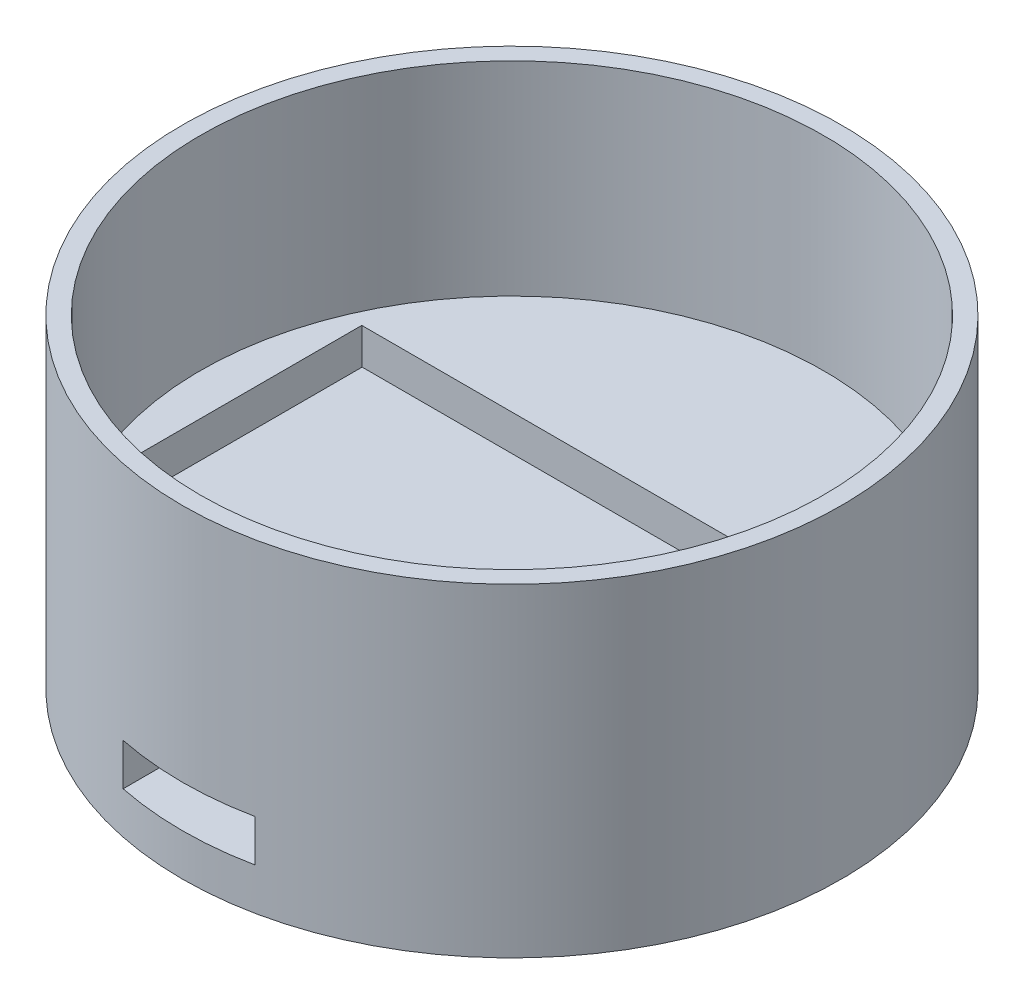
ISO-10303-21;
HEADER;
FILE_DESCRIPTION(('STEP AP214'),'2;1');
FILE_NAME('part.step','',(''),(''),'','','');
FILE_SCHEMA(('AUTOMOTIVE_DESIGN { 1 0 10303 214 1 1 1 1 }'));
ENDSEC;
DATA;
#1=APPLICATION_CONTEXT('core data for automotive mechanical design processes');
#2=APPLICATION_PROTOCOL_DEFINITION('international standard','automotive_design',2000,#1);
#3=PRODUCT_CONTEXT('',#1,'mechanical');
#4=PRODUCT('Part','Part','',(#3));
#5=PRODUCT_RELATED_PRODUCT_CATEGORY('part','',(#4));
#6=PRODUCT_DEFINITION_FORMATION('','',#4);
#7=PRODUCT_DEFINITION_CONTEXT('part definition',#1,'design');
#8=PRODUCT_DEFINITION('design','',#6,#7);
#9=PRODUCT_DEFINITION_SHAPE('','',#8);
#10=(LENGTH_UNIT() NAMED_UNIT(*) SI_UNIT(.MILLI.,.METRE.));
#11=(NAMED_UNIT(*) PLANE_ANGLE_UNIT() SI_UNIT($,.RADIAN.));
#12=(NAMED_UNIT(*) SI_UNIT($,.STERADIAN.) SOLID_ANGLE_UNIT());
#13=UNCERTAINTY_MEASURE_WITH_UNIT(LENGTH_MEASURE(1.E-05),#10,'distance_accuracy_value','');
#14=(GEOMETRIC_REPRESENTATION_CONTEXT(3) GLOBAL_UNCERTAINTY_ASSIGNED_CONTEXT((#13)) GLOBAL_UNIT_ASSIGNED_CONTEXT((#10,
#11,#12)) REPRESENTATION_CONTEXT('',''));
#15=CARTESIAN_POINT('',(0.,0.,0.));
#16=DIRECTION('',(0.,0.,1.));
#17=DIRECTION('',(1.,0.,0.));
#18=AXIS2_PLACEMENT_3D('',#15,#16,#17);
#19=CARTESIAN_POINT('',(0.,20.,0.));
#20=DIRECTION('',(0.,-1.,0.));
#21=DIRECTION('',(0.,0.,-1.));
#22=AXIS2_PLACEMENT_3D('',#19,#20,#21);
#23=CYLINDRICAL_SURFACE('',#22,26.);
#24=CARTESIAN_POINT('',(0.,3.,0.));
#25=DIRECTION('',(0.,1.,0.));
#26=DIRECTION('',(0.,0.,1.));
#27=AXIS2_PLACEMENT_3D('',#24,#25,#26);
#28=CIRCLE('',#27,26.);
#29=CARTESIAN_POINT('',(0.,3.,26.));
#30=VERTEX_POINT('',#29);
#31=EDGE_CURVE('E260',#30,#30,#28,.T.);
#32=ORIENTED_EDGE('',*,*,#31,.F.);
#33=EDGE_LOOP('',(#32));
#34=FACE_BOUND('',#33,.T.);
#35=CARTESIAN_POINT('',(0.,20.,0.));
#36=DIRECTION('',(0.,1.,0.));
#37=DIRECTION('',(0.,0.,1.));
#38=AXIS2_PLACEMENT_3D('',#35,#36,#37);
#39=CIRCLE('',#38,26.);
#40=CARTESIAN_POINT('',(0.,20.,26.));
#41=VERTEX_POINT('',#40);
#42=EDGE_CURVE('E252',#41,#41,#39,.T.);
#43=ORIENTED_EDGE('',*,*,#42,.T.);
#44=EDGE_LOOP('',(#43));
#45=FACE_BOUND('',#44,.T.);
#46=ADVANCED_FACE('F50',(#34,#45),#23,.F.);
#47=CARTESIAN_POINT('',(0.,20.,0.));
#48=DIRECTION('',(0.,-1.,0.));
#49=DIRECTION('',(0.,0.,-1.));
#50=AXIS2_PLACEMENT_3D('',#47,#48,#49);
#51=CYLINDRICAL_SURFACE('',#50,27.5);
#52=DIRECTION('',(0.,-1.,0.));
#53=VECTOR('',#52,1.);
#54=CARTESIAN_POINT('',(5.5,20.,26.944387170615));
#55=LINE('',#54,#53);
#56=CARTESIAN_POINT('',(5.5,0.,26.944387170615));
#57=VERTEX_POINT('',#56);
#58=CARTESIAN_POINT('',(5.5,-3.5,26.944387170615));
#59=VERTEX_POINT('',#58);
#60=EDGE_CURVE('E138',#57,#59,#55,.T.);
#61=ORIENTED_EDGE('',*,*,#60,.T.);
#62=CARTESIAN_POINT('',(0.,-3.5,0.));
#63=DIRECTION('',(0.,-1.,0.));
#64=DIRECTION('',(0.,0.,-1.));
#65=AXIS2_PLACEMENT_3D('',#62,#63,#64);
#66=CIRCLE('',#65,27.5);
#67=CARTESIAN_POINT('',(-5.5,-3.5,26.944387170615));
#68=VERTEX_POINT('',#67);
#69=EDGE_CURVE('E65',#59,#68,#66,.T.);
#70=ORIENTED_EDGE('',*,*,#69,.T.);
#71=DIRECTION('',(0.,-1.,0.));
#72=VECTOR('',#71,1.);
#73=CARTESIAN_POINT('',(-5.5,20.,26.944387170615));
#74=LINE('',#73,#72);
#75=CARTESIAN_POINT('',(-5.5,0.,26.944387170615));
#76=VERTEX_POINT('',#75);
#77=EDGE_CURVE('E148',#68,#76,#74,.F.);
#78=ORIENTED_EDGE('',*,*,#77,.T.);
#79=CARTESIAN_POINT('',(0.,0.,0.));
#80=DIRECTION('',(0.,1.,0.));
#81=DIRECTION('',(0.,0.,1.));
#82=AXIS2_PLACEMENT_3D('',#79,#80,#81);
#83=CIRCLE('',#82,27.5);
#84=EDGE_CURVE('E153',#76,#57,#83,.T.);
#85=ORIENTED_EDGE('',*,*,#84,.T.);
#86=EDGE_LOOP('',(#61,#70,#78,#85));
#87=FACE_BOUND('',#86,.T.);
#88=CARTESIAN_POINT('',(0.,20.,0.));
#89=DIRECTION('',(0.,1.,0.));
#90=DIRECTION('',(0.,0.,1.));
#91=AXIS2_PLACEMENT_3D('',#88,#89,#90);
#92=CIRCLE('',#91,27.5);
#93=CARTESIAN_POINT('',(0.,20.,27.5));
#94=VERTEX_POINT('',#93);
#95=EDGE_CURVE('E256',#94,#94,#92,.T.);
#96=ORIENTED_EDGE('',*,*,#95,.F.);
#97=EDGE_LOOP('',(#96));
#98=FACE_BOUND('',#97,.T.);
#99=CARTESIAN_POINT('',(0.,-7.,0.));
#100=DIRECTION('',(0.,1.,0.));
#101=DIRECTION('',(0.,0.,1.));
#102=AXIS2_PLACEMENT_3D('',#99,#100,#101);
#103=CIRCLE('',#102,27.5);
#104=CARTESIAN_POINT('',(0.,-7.,27.5));
#105=VERTEX_POINT('',#104);
#106=EDGE_CURVE('E182',#105,#105,#103,.T.);
#107=ORIENTED_EDGE('',*,*,#106,.T.);
#108=EDGE_LOOP('',(#107));
#109=FACE_BOUND('',#108,.T.);
#110=ADVANCED_FACE('F150',(#87,#98,#109),#51,.T.);
#111=CARTESIAN_POINT('',(0.,20.,0.));
#112=DIRECTION('',(0.,1.,0.));
#113=DIRECTION('',(0.,0.,1.));
#114=AXIS2_PLACEMENT_3D('',#111,#112,#113);
#115=PLANE('',#114);
#116=ORIENTED_EDGE('',*,*,#42,.F.);
#117=EDGE_LOOP('',(#116));
#118=FACE_BOUND('',#117,.T.);
#119=ORIENTED_EDGE('',*,*,#95,.T.);
#120=EDGE_LOOP('',(#119));
#121=FACE_BOUND('',#120,.T.);
#122=ADVANCED_FACE('F317',(#118,#121),#115,.T.);
#123=CARTESIAN_POINT('',(22.4697410318971,3.,0.));
#124=DIRECTION('',(-1.,0.,0.));
#125=DIRECTION('',(0.,0.,1.));
#126=AXIS2_PLACEMENT_3D('',#123,#124,#125);
#127=PLANE('',#126);
#128=DIRECTION('',(0.,0.,-1.));
#129=VECTOR('',#128,1.);
#130=CARTESIAN_POINT('',(22.4697410318971,0.,0.));
#131=LINE('',#130,#129);
#132=CARTESIAN_POINT('',(22.4697410318971,0.,10.));
#133=VERTEX_POINT('',#132);
#134=CARTESIAN_POINT('',(22.4697410318971,0.,-10.));
#135=VERTEX_POINT('',#134);
#136=EDGE_CURVE('E208',#133,#135,#131,.T.);
#137=ORIENTED_EDGE('',*,*,#136,.F.);
#138=DIRECTION('',(0.,-1.,0.));
#139=VECTOR('',#138,1.);
#140=CARTESIAN_POINT('',(22.4697410318971,3.,10.));
#141=LINE('',#140,#139);
#142=CARTESIAN_POINT('',(22.4697410318971,3.,10.));
#143=VERTEX_POINT('',#142);
#144=EDGE_CURVE('E248',#143,#133,#141,.T.);
#145=ORIENTED_EDGE('',*,*,#144,.F.);
#146=DIRECTION('',(0.,0.,-1.));
#147=VECTOR('',#146,1.);
#148=CARTESIAN_POINT('',(22.4697410318971,3.,0.));
#149=LINE('',#148,#147);
#150=CARTESIAN_POINT('',(22.4697410318971,3.,-10.));
#151=VERTEX_POINT('',#150);
#152=EDGE_CURVE('E212',#143,#151,#149,.T.);
#153=ORIENTED_EDGE('',*,*,#152,.T.);
#154=DIRECTION('',(0.,-1.,0.));
#155=VECTOR('',#154,1.);
#156=CARTESIAN_POINT('',(22.4697410318971,3.,-10.));
#157=LINE('',#156,#155);
#158=EDGE_CURVE('E227',#151,#135,#157,.T.);
#159=ORIENTED_EDGE('',*,*,#158,.T.);
#160=EDGE_LOOP('',(#137,#145,#153,#159));
#161=FACE_BOUND('',#160,.T.);
#162=ADVANCED_FACE('F301',(#161),#127,.T.);
#163=CARTESIAN_POINT('',(0.,3.,10.));
#164=DIRECTION('',(0.,0.,-1.));
#165=DIRECTION('',(-1.,0.,0.));
#166=AXIS2_PLACEMENT_3D('',#163,#164,#165);
#167=PLANE('',#166);
#168=DIRECTION('',(1.,0.,0.));
#169=VECTOR('',#168,1.);
#170=CARTESIAN_POINT('',(0.,0.,10.));
#171=LINE('',#170,#169);
#172=CARTESIAN_POINT('',(-22.5,0.,10.));
#173=VERTEX_POINT('',#172);
#174=CARTESIAN_POINT('',(-5.5,0.,10.));
#175=VERTEX_POINT('',#174);
#176=EDGE_CURVE('E232',#173,#175,#171,.T.);
#177=ORIENTED_EDGE('',*,*,#176,.F.);
#178=DIRECTION('',(0.,1.,0.));
#179=VECTOR('',#178,1.);
#180=CARTESIAN_POINT('',(-22.5,-7.,10.));
#181=LINE('',#180,#179);
#182=CARTESIAN_POINT('',(-22.5,-7.,10.));
#183=VERTEX_POINT('',#182);
#184=EDGE_CURVE('E200',#183,#173,#181,.T.);
#185=ORIENTED_EDGE('',*,*,#184,.F.);
#186=DIRECTION('',(1.,0.,0.));
#187=VECTOR('',#186,1.);
#188=CARTESIAN_POINT('',(0.,-7.,10.));
#189=LINE('',#188,#187);
#190=CARTESIAN_POINT('',(-22.5302589681029,-7.,10.));
#191=VERTEX_POINT('',#190);
#192=EDGE_CURVE('E189',#191,#183,#189,.T.);
#193=ORIENTED_EDGE('',*,*,#192,.F.);
#194=DIRECTION('',(0.,-1.,0.));
#195=VECTOR('',#194,1.);
#196=CARTESIAN_POINT('',(-22.5302589681029,3.,10.));
#197=LINE('',#196,#195);
#198=CARTESIAN_POINT('',(-22.5302589681029,3.,10.));
#199=VERTEX_POINT('',#198);
#200=EDGE_CURVE('E245',#199,#191,#197,.T.);
#201=ORIENTED_EDGE('',*,*,#200,.F.);
#202=DIRECTION('',(1.,0.,0.));
#203=VECTOR('',#202,1.);
#204=CARTESIAN_POINT('',(0.,3.,10.));
#205=LINE('',#204,#203);
#206=EDGE_CURVE('E216',#199,#143,#205,.T.);
#207=ORIENTED_EDGE('',*,*,#206,.T.);
#208=ORIENTED_EDGE('',*,*,#144,.T.);
#209=CARTESIAN_POINT('',(5.5,0.,10.));
#210=VERTEX_POINT('',#209);
#211=EDGE_CURVE('E231',#210,#133,#171,.T.);
#212=ORIENTED_EDGE('',*,*,#211,.F.);
#213=EDGE_CURVE('E236',#175,#210,#171,.T.);
#214=ORIENTED_EDGE('',*,*,#213,.F.);
#215=EDGE_LOOP('',(#177,#185,#193,#201,#207,#208,#212,#214));
#216=FACE_BOUND('',#215,.T.);
#217=ADVANCED_FACE('F274',(#216),#167,.T.);
#218=CARTESIAN_POINT('',(-22.5302589681029,3.,0.));
#219=DIRECTION('',(-1.,0.,0.));
#220=DIRECTION('',(0.,0.,1.));
#221=AXIS2_PLACEMENT_3D('',#218,#219,#220);
#222=PLANE('',#221);
#223=ORIENTED_EDGE('',*,*,#200,.T.);
#224=DIRECTION('',(0.,0.,-1.));
#225=VECTOR('',#224,1.);
#226=CARTESIAN_POINT('',(-22.5302589681029,-7.,0.));
#227=LINE('',#226,#225);
#228=CARTESIAN_POINT('',(-22.5302589681029,-7.,-10.));
#229=VERTEX_POINT('',#228);
#230=EDGE_CURVE('E192',#191,#229,#227,.T.);
#231=ORIENTED_EDGE('',*,*,#230,.T.);
#232=DIRECTION('',(0.,-1.,0.));
#233=VECTOR('',#232,1.);
#234=CARTESIAN_POINT('',(-22.5302589681029,3.,-10.));
#235=LINE('',#234,#233);
#236=CARTESIAN_POINT('',(-22.5302589681029,3.,-10.));
#237=VERTEX_POINT('',#236);
#238=EDGE_CURVE('E242',#237,#229,#235,.T.);
#239=ORIENTED_EDGE('',*,*,#238,.F.);
#240=DIRECTION('',(0.,0.,-1.));
#241=VECTOR('',#240,1.);
#242=CARTESIAN_POINT('',(-22.5302589681029,3.,0.));
#243=LINE('',#242,#241);
#244=EDGE_CURVE('E221',#199,#237,#243,.T.);
#245=ORIENTED_EDGE('',*,*,#244,.F.);
#246=EDGE_LOOP('',(#223,#231,#239,#245));
#247=FACE_BOUND('',#246,.T.);
#248=ADVANCED_FACE('F292',(#247),#222,.F.);
#249=CARTESIAN_POINT('',(0.,3.,-10.));
#250=DIRECTION('',(0.,0.,-1.));
#251=DIRECTION('',(-1.,0.,0.));
#252=AXIS2_PLACEMENT_3D('',#249,#250,#251);
#253=PLANE('',#252);
#254=ORIENTED_EDGE('',*,*,#238,.T.);
#255=DIRECTION('',(1.,0.,0.));
#256=VECTOR('',#255,1.);
#257=CARTESIAN_POINT('',(0.,-7.,-10.));
#258=LINE('',#257,#256);
#259=CARTESIAN_POINT('',(-22.5,-7.,-10.));
#260=VERTEX_POINT('',#259);
#261=EDGE_CURVE('E196',#229,#260,#258,.T.);
#262=ORIENTED_EDGE('',*,*,#261,.T.);
#263=DIRECTION('',(0.,1.,0.));
#264=VECTOR('',#263,1.);
#265=CARTESIAN_POINT('',(-22.5,-7.,-10.));
#266=LINE('',#265,#264);
#267=CARTESIAN_POINT('',(-22.5,0.,-10.));
#268=VERTEX_POINT('',#267);
#269=EDGE_CURVE('E204',#260,#268,#266,.T.);
#270=ORIENTED_EDGE('',*,*,#269,.T.);
#271=DIRECTION('',(1.,0.,0.));
#272=VECTOR('',#271,1.);
#273=CARTESIAN_POINT('',(0.,0.,-10.));
#274=LINE('',#273,#272);
#275=EDGE_CURVE('E217',#268,#135,#274,.T.);
#276=ORIENTED_EDGE('',*,*,#275,.T.);
#277=ORIENTED_EDGE('',*,*,#158,.F.);
#278=DIRECTION('',(1.,0.,0.));
#279=VECTOR('',#278,1.);
#280=CARTESIAN_POINT('',(0.,3.,-10.));
#281=LINE('',#280,#279);
#282=EDGE_CURVE('E224',#237,#151,#281,.T.);
#283=ORIENTED_EDGE('',*,*,#282,.F.);
#284=EDGE_LOOP('',(#254,#262,#270,#276,#277,#283));
#285=FACE_BOUND('',#284,.T.);
#286=ADVANCED_FACE('F342',(#285),#253,.F.);
#287=CARTESIAN_POINT('',(0.,3.,0.));
#288=DIRECTION('',(0.,1.,0.));
#289=DIRECTION('',(0.,0.,1.));
#290=AXIS2_PLACEMENT_3D('',#287,#288,#289);
#291=PLANE('',#290);
#292=ORIENTED_EDGE('',*,*,#152,.F.);
#293=ORIENTED_EDGE('',*,*,#206,.F.);
#294=ORIENTED_EDGE('',*,*,#244,.T.);
#295=ORIENTED_EDGE('',*,*,#282,.T.);
#296=EDGE_LOOP('',(#292,#293,#294,#295));
#297=FACE_BOUND('',#296,.T.);
#298=ORIENTED_EDGE('',*,*,#31,.T.);
#299=EDGE_LOOP('',(#298));
#300=FACE_BOUND('',#299,.T.);
#301=ADVANCED_FACE('F297',(#297,#300),#291,.T.);
#302=CARTESIAN_POINT('',(0.,0.,0.));
#303=DIRECTION('',(0.,1.,0.));
#304=DIRECTION('',(0.,0.,1.));
#305=AXIS2_PLACEMENT_3D('',#302,#303,#304);
#306=PLANE('',#305);
#307=DIRECTION('',(0.,0.,-1.));
#308=VECTOR('',#307,1.);
#309=CARTESIAN_POINT('',(5.5,0.,0.));
#310=LINE('',#309,#308);
#311=CARTESIAN_POINT('',(5.5,0.,7.5));
#312=VERTEX_POINT('',#311);
#313=EDGE_CURVE('E12',#210,#312,#310,.T.);
#314=ORIENTED_EDGE('',*,*,#313,.F.);
#315=ORIENTED_EDGE('',*,*,#211,.T.);
#316=ORIENTED_EDGE('',*,*,#136,.T.);
#317=ORIENTED_EDGE('',*,*,#275,.F.);
#318=DIRECTION('',(0.,0.,-1.));
#319=VECTOR('',#318,1.);
#320=CARTESIAN_POINT('',(-22.5,0.,0.));
#321=LINE('',#320,#319);
#322=EDGE_CURVE('E175',#173,#268,#321,.T.);
#323=ORIENTED_EDGE('',*,*,#322,.F.);
#324=ORIENTED_EDGE('',*,*,#176,.T.);
#325=DIRECTION('',(0.,0.,1.));
#326=VECTOR('',#325,1.);
#327=CARTESIAN_POINT('',(-5.5,0.,0.));
#328=LINE('',#327,#326);
#329=CARTESIAN_POINT('',(-5.5,0.,7.5));
#330=VERTEX_POINT('',#329);
#331=EDGE_CURVE('E58',#330,#175,#328,.T.);
#332=ORIENTED_EDGE('',*,*,#331,.F.);
#333=DIRECTION('',(1.,0.,0.));
#334=VECTOR('',#333,1.);
#335=CARTESIAN_POINT('',(5.5,0.,7.5));
#336=LINE('',#335,#334);
#337=EDGE_CURVE('E143',#330,#312,#336,.T.);
#338=ORIENTED_EDGE('',*,*,#337,.T.);
#339=EDGE_LOOP('',(#314,#315,#316,#317,#323,#324,#332,#338));
#340=FACE_BOUND('',#339,.T.);
#341=ADVANCED_FACE('F279',(#340),#306,.T.);
#342=CARTESIAN_POINT('',(-22.5,-7.,0.));
#343=DIRECTION('',(1.,0.,0.));
#344=DIRECTION('',(0.,0.,-1.));
#345=AXIS2_PLACEMENT_3D('',#342,#343,#344);
#346=PLANE('',#345);
#347=ORIENTED_EDGE('',*,*,#322,.T.);
#348=ORIENTED_EDGE('',*,*,#269,.F.);
#349=DIRECTION('',(0.,0.,-1.));
#350=VECTOR('',#349,1.);
#351=CARTESIAN_POINT('',(-22.5,-7.,0.));
#352=LINE('',#351,#350);
#353=EDGE_CURVE('E186',#183,#260,#352,.T.);
#354=ORIENTED_EDGE('',*,*,#353,.F.);
#355=ORIENTED_EDGE('',*,*,#184,.T.);
#356=EDGE_LOOP('',(#347,#348,#354,#355));
#357=FACE_BOUND('',#356,.T.);
#358=ADVANCED_FACE('F282',(#357),#346,.F.);
#359=CARTESIAN_POINT('',(0.,-7.,0.));
#360=DIRECTION('',(0.,1.,0.));
#361=DIRECTION('',(0.,0.,1.));
#362=AXIS2_PLACEMENT_3D('',#359,#360,#361);
#363=PLANE('',#362);
#364=ORIENTED_EDGE('',*,*,#106,.F.);
#365=EDGE_LOOP('',(#364));
#366=FACE_BOUND('',#365,.T.);
#367=ORIENTED_EDGE('',*,*,#353,.T.);
#368=ORIENTED_EDGE('',*,*,#261,.F.);
#369=ORIENTED_EDGE('',*,*,#230,.F.);
#370=ORIENTED_EDGE('',*,*,#192,.T.);
#371=EDGE_LOOP('',(#367,#368,#369,#370));
#372=FACE_BOUND('',#371,.T.);
#373=ADVANCED_FACE('F289',(#366,#372),#363,.F.);
#374=CARTESIAN_POINT('',(5.5,-3.5,12.5));
#375=DIRECTION('',(1.,0.,0.));
#376=DIRECTION('',(0.,0.,-1.));
#377=AXIS2_PLACEMENT_3D('',#374,#375,#376);
#378=PLANE('',#377);
#379=DIRECTION('',(0.,0.,-1.));
#380=VECTOR('',#379,1.);
#381=CARTESIAN_POINT('',(5.5,0.,12.5));
#382=LINE('',#381,#380);
#383=EDGE_CURVE('E172',#57,#210,#382,.T.);
#384=ORIENTED_EDGE('',*,*,#383,.T.);
#385=ORIENTED_EDGE('',*,*,#313,.T.);
#386=DIRECTION('',(0.,-1.,0.));
#387=VECTOR('',#386,1.);
#388=CARTESIAN_POINT('',(5.5,-3.5,7.5));
#389=LINE('',#388,#387);
#390=CARTESIAN_POINT('',(5.5,-3.5,7.5));
#391=VERTEX_POINT('',#390);
#392=EDGE_CURVE('E73',#312,#391,#389,.T.);
#393=ORIENTED_EDGE('',*,*,#392,.T.);
#394=DIRECTION('',(0.,0.,-1.));
#395=VECTOR('',#394,1.);
#396=CARTESIAN_POINT('',(5.5,-3.5,12.5));
#397=LINE('',#396,#395);
#398=EDGE_CURVE('E135',#59,#391,#397,.T.);
#399=ORIENTED_EDGE('',*,*,#398,.F.);
#400=ORIENTED_EDGE('',*,*,#60,.F.);
#401=EDGE_LOOP('',(#384,#385,#393,#399,#400));
#402=FACE_BOUND('',#401,.T.);
#403=ADVANCED_FACE('F137',(#402),#378,.F.);
#404=CARTESIAN_POINT('',(5.5,0.,12.5));
#405=DIRECTION('',(0.,1.,0.));
#406=DIRECTION('',(0.,0.,1.));
#407=AXIS2_PLACEMENT_3D('',#404,#405,#406);
#408=PLANE('',#407);
#409=ORIENTED_EDGE('',*,*,#213,.T.);
#410=ORIENTED_EDGE('',*,*,#383,.F.);
#411=ORIENTED_EDGE('',*,*,#84,.F.);
#412=DIRECTION('',(0.,0.,-1.));
#413=VECTOR('',#412,1.);
#414=CARTESIAN_POINT('',(-5.5,0.,12.5));
#415=LINE('',#414,#413);
#416=EDGE_CURVE('E176',#76,#175,#415,.T.);
#417=ORIENTED_EDGE('',*,*,#416,.T.);
#418=EDGE_LOOP('',(#409,#410,#411,#417));
#419=FACE_BOUND('',#418,.T.);
#420=ADVANCED_FACE('F271',(#419),#408,.F.);
#421=CARTESIAN_POINT('',(-5.5,-3.5,12.5));
#422=DIRECTION('',(-1.,0.,0.));
#423=DIRECTION('',(0.,0.,1.));
#424=AXIS2_PLACEMENT_3D('',#421,#422,#423);
#425=PLANE('',#424);
#426=DIRECTION('',(0.,0.,-1.));
#427=VECTOR('',#426,1.);
#428=CARTESIAN_POINT('',(-5.5,-3.5,12.5));
#429=LINE('',#428,#427);
#430=CARTESIAN_POINT('',(-5.5,-3.5,7.5));
#431=VERTEX_POINT('',#430);
#432=EDGE_CURVE('E142',#68,#431,#429,.T.);
#433=ORIENTED_EDGE('',*,*,#432,.T.);
#434=DIRECTION('',(0.,1.,0.));
#435=VECTOR('',#434,1.);
#436=CARTESIAN_POINT('',(-5.5,-3.5,7.5));
#437=LINE('',#436,#435);
#438=EDGE_CURVE('E166',#431,#330,#437,.T.);
#439=ORIENTED_EDGE('',*,*,#438,.T.);
#440=ORIENTED_EDGE('',*,*,#331,.T.);
#441=ORIENTED_EDGE('',*,*,#416,.F.);
#442=ORIENTED_EDGE('',*,*,#77,.F.);
#443=EDGE_LOOP('',(#433,#439,#440,#441,#442));
#444=FACE_BOUND('',#443,.T.);
#445=ADVANCED_FACE('F266',(#444),#425,.F.);
#446=CARTESIAN_POINT('',(5.5,-3.5,12.5));
#447=DIRECTION('',(0.,-1.,0.));
#448=DIRECTION('',(0.,0.,-1.));
#449=AXIS2_PLACEMENT_3D('',#446,#447,#448);
#450=PLANE('',#449);
#451=ORIENTED_EDGE('',*,*,#398,.T.);
#452=DIRECTION('',(-1.,0.,0.));
#453=VECTOR('',#452,1.);
#454=CARTESIAN_POINT('',(5.5,-3.5,7.5));
#455=LINE('',#454,#453);
#456=EDGE_CURVE('E159',#391,#431,#455,.T.);
#457=ORIENTED_EDGE('',*,*,#456,.T.);
#458=ORIENTED_EDGE('',*,*,#432,.F.);
#459=ORIENTED_EDGE('',*,*,#69,.F.);
#460=EDGE_LOOP('',(#451,#457,#458,#459));
#461=FACE_BOUND('',#460,.T.);
#462=ADVANCED_FACE('F145',(#461),#450,.F.);
#463=CARTESIAN_POINT('',(0.,0.,7.5));
#464=DIRECTION('',(0.,0.,1.));
#465=DIRECTION('',(1.,0.,0.));
#466=AXIS2_PLACEMENT_3D('',#463,#464,#465);
#467=PLANE('',#466);
#468=ORIENTED_EDGE('',*,*,#392,.F.);
#469=ORIENTED_EDGE('',*,*,#337,.F.);
#470=ORIENTED_EDGE('',*,*,#438,.F.);
#471=ORIENTED_EDGE('',*,*,#456,.F.);
#472=EDGE_LOOP('',(#468,#469,#470,#471));
#473=FACE_BOUND('',#472,.T.);
#474=ADVANCED_FACE('F304',(#473),#467,.T.);
#475=CLOSED_SHELL('',(#46,#110,#122,#162,#217,#248,#286,#301,#341,#358,#373,#403,#420,#445,#462,#474));
#476=MANIFOLD_SOLID_BREP('B2',#475);
#477=ADVANCED_BREP_SHAPE_REPRESENTATION('',(#18,#476),#14);
#478=SHAPE_DEFINITION_REPRESENTATION(#9,#477);
ENDSEC;
END-ISO-10303-21;
